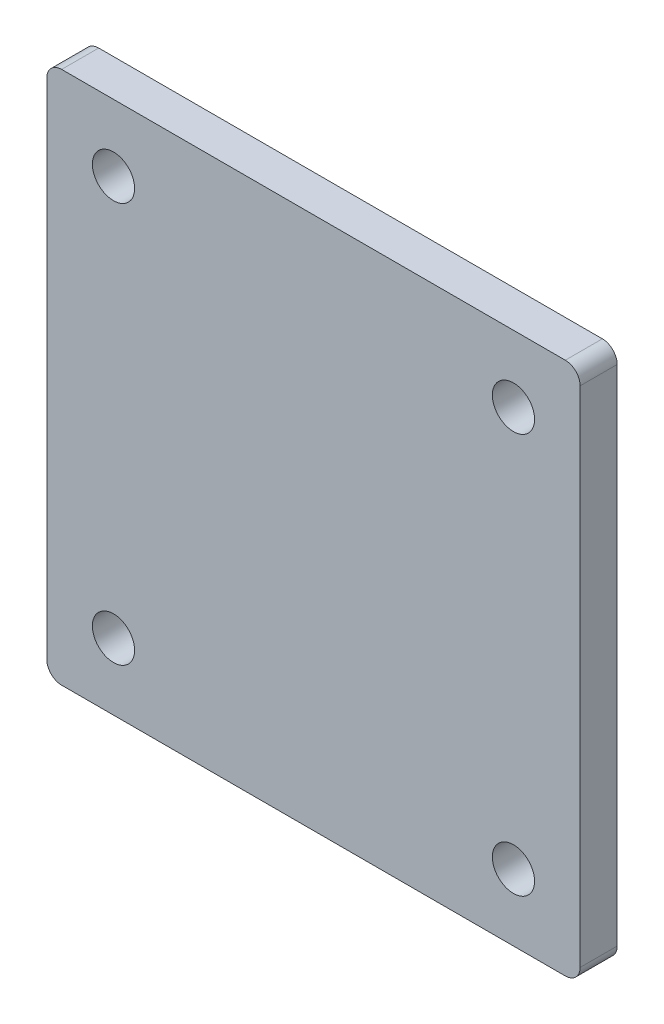
ISO-10303-21;
HEADER;
FILE_DESCRIPTION(('STEP AP214'),'2;1');
FILE_NAME('part.step','',(''),(''),'','','');
FILE_SCHEMA(('AUTOMOTIVE_DESIGN { 1 0 10303 214 1 1 1 1 }'));
ENDSEC;
DATA;
#1=APPLICATION_CONTEXT('core data for automotive mechanical design processes');
#2=APPLICATION_PROTOCOL_DEFINITION('international standard','automotive_design',2000,#1);
#3=PRODUCT_CONTEXT('',#1,'mechanical');
#4=PRODUCT('Part','Part','',(#3));
#5=PRODUCT_RELATED_PRODUCT_CATEGORY('part','',(#4));
#6=PRODUCT_DEFINITION_FORMATION('','',#4);
#7=PRODUCT_DEFINITION_CONTEXT('part definition',#1,'design');
#8=PRODUCT_DEFINITION('design','',#6,#7);
#9=PRODUCT_DEFINITION_SHAPE('','',#8);
#10=(LENGTH_UNIT() NAMED_UNIT(*) SI_UNIT(.MILLI.,.METRE.));
#11=(NAMED_UNIT(*) PLANE_ANGLE_UNIT() SI_UNIT($,.RADIAN.));
#12=(NAMED_UNIT(*) SI_UNIT($,.STERADIAN.) SOLID_ANGLE_UNIT());
#13=UNCERTAINTY_MEASURE_WITH_UNIT(LENGTH_MEASURE(1.E-05),#10,'distance_accuracy_value','');
#14=(GEOMETRIC_REPRESENTATION_CONTEXT(3) GLOBAL_UNCERTAINTY_ASSIGNED_CONTEXT((#13)) GLOBAL_UNIT_ASSIGNED_CONTEXT((#10,
#11,#12)) REPRESENTATION_CONTEXT('',''));
#15=CARTESIAN_POINT('',(0.,0.,0.));
#16=DIRECTION('',(0.,0.,1.));
#17=DIRECTION('',(1.,0.,0.));
#18=AXIS2_PLACEMENT_3D('',#15,#16,#17);
#19=CARTESIAN_POINT('',(0.,0.,5.));
#20=DIRECTION('',(0.,0.,1.));
#21=DIRECTION('',(1.,0.,0.));
#22=AXIS2_PLACEMENT_3D('',#19,#20,#21);
#23=PLANE('',#22);
#24=CARTESIAN_POINT('',(27.,-27.,5.));
#25=DIRECTION('',(0.,0.,1.));
#26=DIRECTION('',(1.,0.,0.));
#27=AXIS2_PLACEMENT_3D('',#24,#25,#26);
#28=CIRCLE('',#27,2.85);
#29=CARTESIAN_POINT('',(29.85,-27.,5.));
#30=VERTEX_POINT('',#29);
#31=EDGE_CURVE('E186',#30,#30,#28,.T.);
#32=ORIENTED_EDGE('',*,*,#31,.F.);
#33=EDGE_LOOP('',(#32));
#34=FACE_BOUND('',#33,.T.);
#35=CARTESIAN_POINT('',(-27.,27.,5.));
#36=DIRECTION('',(0.,0.,1.));
#37=DIRECTION('',(1.,0.,0.));
#38=AXIS2_PLACEMENT_3D('',#35,#36,#37);
#39=CIRCLE('',#38,2.85);
#40=CARTESIAN_POINT('',(-24.15,27.,5.));
#41=VERTEX_POINT('',#40);
#42=EDGE_CURVE('E130',#41,#41,#39,.T.);
#43=ORIENTED_EDGE('',*,*,#42,.F.);
#44=EDGE_LOOP('',(#43));
#45=FACE_BOUND('',#44,.T.);
#46=DIRECTION('',(0.,-1.,0.));
#47=VECTOR('',#46,1.);
#48=CARTESIAN_POINT('',(-36.,-36.,5.));
#49=LINE('',#48,#47);
#50=CARTESIAN_POINT('',(-36.,34.,5.));
#51=VERTEX_POINT('',#50);
#52=CARTESIAN_POINT('',(-36.,-34.,5.));
#53=VERTEX_POINT('',#52);
#54=EDGE_CURVE('E122',#51,#53,#49,.T.);
#55=ORIENTED_EDGE('',*,*,#54,.T.);
#56=CARTESIAN_POINT('',(-34.,-34.,5.));
#57=DIRECTION('',(0.,0.,1.));
#58=DIRECTION('',(1.,0.,0.));
#59=AXIS2_PLACEMENT_3D('',#56,#57,#58);
#60=CIRCLE('',#59,2.);
#61=CARTESIAN_POINT('',(-34.,-36.,5.));
#62=VERTEX_POINT('',#61);
#63=EDGE_CURVE('E162',#53,#62,#60,.T.);
#64=ORIENTED_EDGE('',*,*,#63,.T.);
#65=DIRECTION('',(1.,0.,0.));
#66=VECTOR('',#65,1.);
#67=CARTESIAN_POINT('',(36.,-36.,5.));
#68=LINE('',#67,#66);
#69=CARTESIAN_POINT('',(34.,-36.,5.));
#70=VERTEX_POINT('',#69);
#71=EDGE_CURVE('E176',#62,#70,#68,.T.);
#72=ORIENTED_EDGE('',*,*,#71,.T.);
#73=CARTESIAN_POINT('',(34.,-34.,5.));
#74=DIRECTION('',(0.,0.,1.));
#75=DIRECTION('',(1.,0.,0.));
#76=AXIS2_PLACEMENT_3D('',#73,#74,#75);
#77=CIRCLE('',#76,2.);
#78=CARTESIAN_POINT('',(36.,-34.,5.));
#79=VERTEX_POINT('',#78);
#80=EDGE_CURVE('E58',#70,#79,#77,.T.);
#81=ORIENTED_EDGE('',*,*,#80,.T.);
#82=DIRECTION('',(0.,1.,0.));
#83=VECTOR('',#82,1.);
#84=CARTESIAN_POINT('',(36.,-36.,5.));
#85=LINE('',#84,#83);
#86=CARTESIAN_POINT('',(36.,34.,5.));
#87=VERTEX_POINT('',#86);
#88=EDGE_CURVE('E168',#79,#87,#85,.T.);
#89=ORIENTED_EDGE('',*,*,#88,.T.);
#90=CARTESIAN_POINT('',(34.,34.,5.));
#91=DIRECTION('',(0.,0.,1.));
#92=DIRECTION('',(1.,0.,0.));
#93=AXIS2_PLACEMENT_3D('',#90,#91,#92);
#94=CIRCLE('',#93,2.);
#95=CARTESIAN_POINT('',(34.,36.,5.));
#96=VERTEX_POINT('',#95);
#97=EDGE_CURVE('E159',#87,#96,#94,.T.);
#98=ORIENTED_EDGE('',*,*,#97,.T.);
#99=DIRECTION('',(-1.,0.,0.));
#100=VECTOR('',#99,1.);
#101=CARTESIAN_POINT('',(36.,36.,5.));
#102=LINE('',#101,#100);
#103=CARTESIAN_POINT('',(-34.,36.,5.));
#104=VERTEX_POINT('',#103);
#105=EDGE_CURVE('E123',#96,#104,#102,.T.);
#106=ORIENTED_EDGE('',*,*,#105,.T.);
#107=CARTESIAN_POINT('',(-34.,34.,5.));
#108=DIRECTION('',(0.,0.,1.));
#109=DIRECTION('',(1.,0.,0.));
#110=AXIS2_PLACEMENT_3D('',#107,#108,#109);
#111=CIRCLE('',#110,2.);
#112=EDGE_CURVE('E145',#104,#51,#111,.T.);
#113=ORIENTED_EDGE('',*,*,#112,.T.);
#114=EDGE_LOOP('',(#55,#64,#72,#81,#89,#98,#106,#113));
#115=FACE_BOUND('',#114,.T.);
#116=CARTESIAN_POINT('',(27.,27.,5.));
#117=DIRECTION('',(0.,0.,1.));
#118=DIRECTION('',(1.,0.,0.));
#119=AXIS2_PLACEMENT_3D('',#116,#117,#118);
#120=CIRCLE('',#119,2.85);
#121=CARTESIAN_POINT('',(29.85,27.,5.));
#122=VERTEX_POINT('',#121);
#123=EDGE_CURVE('E181',#122,#122,#120,.T.);
#124=ORIENTED_EDGE('',*,*,#123,.F.);
#125=EDGE_LOOP('',(#124));
#126=FACE_BOUND('',#125,.T.);
#127=CARTESIAN_POINT('',(-27.,-27.,5.));
#128=DIRECTION('',(0.,0.,1.));
#129=DIRECTION('',(1.,0.,0.));
#130=AXIS2_PLACEMENT_3D('',#127,#128,#129);
#131=CIRCLE('',#130,2.85);
#132=CARTESIAN_POINT('',(-24.15,-27.,5.));
#133=VERTEX_POINT('',#132);
#134=EDGE_CURVE('E192',#133,#133,#131,.T.);
#135=ORIENTED_EDGE('',*,*,#134,.F.);
#136=EDGE_LOOP('',(#135));
#137=FACE_BOUND('',#136,.T.);
#138=ADVANCED_FACE('F36',(#34,#45,#115,#126,#137),#23,.T.);
#139=CARTESIAN_POINT('',(0.,0.,0.));
#140=DIRECTION('',(0.,0.,1.));
#141=DIRECTION('',(1.,0.,0.));
#142=AXIS2_PLACEMENT_3D('',#139,#140,#141);
#143=PLANE('',#142);
#144=DIRECTION('',(1.,0.,0.));
#145=VECTOR('',#144,1.);
#146=CARTESIAN_POINT('',(36.,-36.,0.));
#147=LINE('',#146,#145);
#148=CARTESIAN_POINT('',(-34.,-36.,0.));
#149=VERTEX_POINT('',#148);
#150=CARTESIAN_POINT('',(34.,-36.,0.));
#151=VERTEX_POINT('',#150);
#152=EDGE_CURVE('E129',#149,#151,#147,.T.);
#153=ORIENTED_EDGE('',*,*,#152,.F.);
#154=CARTESIAN_POINT('',(-34.,-34.,0.));
#155=DIRECTION('',(0.,0.,1.));
#156=DIRECTION('',(1.,0.,0.));
#157=AXIS2_PLACEMENT_3D('',#154,#155,#156);
#158=CIRCLE('',#157,2.);
#159=CARTESIAN_POINT('',(-36.,-34.,0.));
#160=VERTEX_POINT('',#159);
#161=EDGE_CURVE('E128',#149,#160,#158,.F.);
#162=ORIENTED_EDGE('',*,*,#161,.T.);
#163=DIRECTION('',(0.,-1.,0.));
#164=VECTOR('',#163,1.);
#165=CARTESIAN_POINT('',(-36.,-36.,0.));
#166=LINE('',#165,#164);
#167=CARTESIAN_POINT('',(-36.,34.,0.));
#168=VERTEX_POINT('',#167);
#169=EDGE_CURVE('E119',#168,#160,#166,.T.);
#170=ORIENTED_EDGE('',*,*,#169,.F.);
#171=CARTESIAN_POINT('',(-34.,34.,0.));
#172=DIRECTION('',(0.,0.,1.));
#173=DIRECTION('',(1.,0.,0.));
#174=AXIS2_PLACEMENT_3D('',#171,#172,#173);
#175=CIRCLE('',#174,2.);
#176=CARTESIAN_POINT('',(-34.,36.,0.));
#177=VERTEX_POINT('',#176);
#178=EDGE_CURVE('E104',#168,#177,#175,.F.);
#179=ORIENTED_EDGE('',*,*,#178,.T.);
#180=DIRECTION('',(-1.,0.,0.));
#181=VECTOR('',#180,1.);
#182=CARTESIAN_POINT('',(36.,36.,0.));
#183=LINE('',#182,#181);
#184=CARTESIAN_POINT('',(34.,36.,0.));
#185=VERTEX_POINT('',#184);
#186=EDGE_CURVE('E142',#185,#177,#183,.T.);
#187=ORIENTED_EDGE('',*,*,#186,.F.);
#188=CARTESIAN_POINT('',(34.,34.,0.));
#189=DIRECTION('',(0.,0.,1.));
#190=DIRECTION('',(1.,0.,0.));
#191=AXIS2_PLACEMENT_3D('',#188,#189,#190);
#192=CIRCLE('',#191,2.);
#193=CARTESIAN_POINT('',(36.,34.,0.));
#194=VERTEX_POINT('',#193);
#195=EDGE_CURVE('E152',#185,#194,#192,.F.);
#196=ORIENTED_EDGE('',*,*,#195,.T.);
#197=DIRECTION('',(0.,1.,0.));
#198=VECTOR('',#197,1.);
#199=CARTESIAN_POINT('',(36.,-36.,0.));
#200=LINE('',#199,#198);
#201=CARTESIAN_POINT('',(36.,-34.,0.));
#202=VERTEX_POINT('',#201);
#203=EDGE_CURVE('E133',#202,#194,#200,.T.);
#204=ORIENTED_EDGE('',*,*,#203,.F.);
#205=CARTESIAN_POINT('',(34.,-34.,0.));
#206=DIRECTION('',(0.,0.,1.));
#207=DIRECTION('',(1.,0.,0.));
#208=AXIS2_PLACEMENT_3D('',#205,#206,#207);
#209=CIRCLE('',#208,2.);
#210=EDGE_CURVE('E154',#202,#151,#209,.F.);
#211=ORIENTED_EDGE('',*,*,#210,.T.);
#212=EDGE_LOOP('',(#153,#162,#170,#179,#187,#196,#204,#211));
#213=FACE_BOUND('',#212,.T.);
#214=CARTESIAN_POINT('',(-27.,27.,0.));
#215=DIRECTION('',(0.,0.,1.));
#216=DIRECTION('',(1.,0.,0.));
#217=AXIS2_PLACEMENT_3D('',#214,#215,#216);
#218=CIRCLE('',#217,2.85);
#219=CARTESIAN_POINT('',(-24.15,27.,0.));
#220=VERTEX_POINT('',#219);
#221=EDGE_CURVE('E136',#220,#220,#218,.T.);
#222=ORIENTED_EDGE('',*,*,#221,.T.);
#223=EDGE_LOOP('',(#222));
#224=FACE_BOUND('',#223,.T.);
#225=CARTESIAN_POINT('',(27.,27.,0.));
#226=DIRECTION('',(0.,0.,1.));
#227=DIRECTION('',(1.,0.,0.));
#228=AXIS2_PLACEMENT_3D('',#225,#226,#227);
#229=CIRCLE('',#228,2.85);
#230=CARTESIAN_POINT('',(29.85,27.,0.));
#231=VERTEX_POINT('',#230);
#232=EDGE_CURVE('E183',#231,#231,#229,.T.);
#233=ORIENTED_EDGE('',*,*,#232,.T.);
#234=EDGE_LOOP('',(#233));
#235=FACE_BOUND('',#234,.T.);
#236=CARTESIAN_POINT('',(27.,-27.,0.));
#237=DIRECTION('',(0.,0.,1.));
#238=DIRECTION('',(1.,0.,0.));
#239=AXIS2_PLACEMENT_3D('',#236,#237,#238);
#240=CIRCLE('',#239,2.85);
#241=CARTESIAN_POINT('',(29.85,-27.,0.));
#242=VERTEX_POINT('',#241);
#243=EDGE_CURVE('E189',#242,#242,#240,.T.);
#244=ORIENTED_EDGE('',*,*,#243,.T.);
#245=EDGE_LOOP('',(#244));
#246=FACE_BOUND('',#245,.T.);
#247=CARTESIAN_POINT('',(-27.,-27.,0.));
#248=DIRECTION('',(0.,0.,1.));
#249=DIRECTION('',(1.,0.,0.));
#250=AXIS2_PLACEMENT_3D('',#247,#248,#249);
#251=CIRCLE('',#250,2.85);
#252=CARTESIAN_POINT('',(-24.15,-27.,0.));
#253=VERTEX_POINT('',#252);
#254=EDGE_CURVE('E195',#253,#253,#251,.T.);
#255=ORIENTED_EDGE('',*,*,#254,.T.);
#256=EDGE_LOOP('',(#255));
#257=FACE_BOUND('',#256,.T.);
#258=ADVANCED_FACE('F126',(#213,#224,#235,#246,#257),#143,.F.);
#259=CARTESIAN_POINT('',(-36.,-36.,5.));
#260=DIRECTION('',(1.,0.,0.));
#261=DIRECTION('',(0.,0.,-1.));
#262=AXIS2_PLACEMENT_3D('',#259,#260,#261);
#263=PLANE('',#262);
#264=ORIENTED_EDGE('',*,*,#169,.T.);
#265=DIRECTION('',(0.,0.,-1.));
#266=VECTOR('',#265,1.);
#267=CARTESIAN_POINT('',(-36.,-34.,5.));
#268=LINE('',#267,#266);
#269=EDGE_CURVE('E157',#160,#53,#268,.F.);
#270=ORIENTED_EDGE('',*,*,#269,.T.);
#271=ORIENTED_EDGE('',*,*,#54,.F.);
#272=DIRECTION('',(0.,0.,-1.));
#273=VECTOR('',#272,1.);
#274=CARTESIAN_POINT('',(-36.,34.,5.));
#275=LINE('',#274,#273);
#276=EDGE_CURVE('E108',#51,#168,#275,.T.);
#277=ORIENTED_EDGE('',*,*,#276,.T.);
#278=EDGE_LOOP('',(#264,#270,#271,#277));
#279=FACE_BOUND('',#278,.T.);
#280=ADVANCED_FACE('F118',(#279),#263,.F.);
#281=CARTESIAN_POINT('',(36.,-36.,5.));
#282=DIRECTION('',(0.,1.,0.));
#283=DIRECTION('',(-1.,0.,0.));
#284=AXIS2_PLACEMENT_3D('',#281,#282,#283);
#285=PLANE('',#284);
#286=ORIENTED_EDGE('',*,*,#71,.F.);
#287=DIRECTION('',(0.,0.,-1.));
#288=VECTOR('',#287,1.);
#289=CARTESIAN_POINT('',(-34.,-36.,5.));
#290=LINE('',#289,#288);
#291=EDGE_CURVE('E149',#62,#149,#290,.T.);
#292=ORIENTED_EDGE('',*,*,#291,.T.);
#293=ORIENTED_EDGE('',*,*,#152,.T.);
#294=DIRECTION('',(0.,0.,-1.));
#295=VECTOR('',#294,1.);
#296=CARTESIAN_POINT('',(34.,-36.,5.));
#297=LINE('',#296,#295);
#298=EDGE_CURVE('E147',#151,#70,#297,.F.);
#299=ORIENTED_EDGE('',*,*,#298,.T.);
#300=EDGE_LOOP('',(#286,#292,#293,#299));
#301=FACE_BOUND('',#300,.T.);
#302=ADVANCED_FACE('F221',(#301),#285,.F.);
#303=CARTESIAN_POINT('',(36.,-36.,5.));
#304=DIRECTION('',(-1.,0.,0.));
#305=DIRECTION('',(0.,0.,1.));
#306=AXIS2_PLACEMENT_3D('',#303,#304,#305);
#307=PLANE('',#306);
#308=ORIENTED_EDGE('',*,*,#88,.F.);
#309=DIRECTION('',(0.,0.,-1.));
#310=VECTOR('',#309,1.);
#311=CARTESIAN_POINT('',(36.,-34.,5.));
#312=LINE('',#311,#310);
#313=EDGE_CURVE('E44',#79,#202,#312,.T.);
#314=ORIENTED_EDGE('',*,*,#313,.T.);
#315=ORIENTED_EDGE('',*,*,#203,.T.);
#316=DIRECTION('',(0.,0.,-1.));
#317=VECTOR('',#316,1.);
#318=CARTESIAN_POINT('',(36.,34.,5.));
#319=LINE('',#318,#317);
#320=EDGE_CURVE('E51',#194,#87,#319,.F.);
#321=ORIENTED_EDGE('',*,*,#320,.T.);
#322=EDGE_LOOP('',(#308,#314,#315,#321));
#323=FACE_BOUND('',#322,.T.);
#324=ADVANCED_FACE('F167',(#323),#307,.F.);
#325=CARTESIAN_POINT('',(36.,36.,5.));
#326=DIRECTION('',(0.,-1.,0.));
#327=DIRECTION('',(1.,0.,0.));
#328=AXIS2_PLACEMENT_3D('',#325,#326,#327);
#329=PLANE('',#328);
#330=ORIENTED_EDGE('',*,*,#105,.F.);
#331=DIRECTION('',(0.,0.,-1.));
#332=VECTOR('',#331,1.);
#333=CARTESIAN_POINT('',(34.,36.,5.));
#334=LINE('',#333,#332);
#335=EDGE_CURVE('E11',#96,#185,#334,.T.);
#336=ORIENTED_EDGE('',*,*,#335,.T.);
#337=ORIENTED_EDGE('',*,*,#186,.T.);
#338=DIRECTION('',(0.,0.,-1.));
#339=VECTOR('',#338,1.);
#340=CARTESIAN_POINT('',(-34.,36.,5.));
#341=LINE('',#340,#339);
#342=EDGE_CURVE('E110',#177,#104,#341,.F.);
#343=ORIENTED_EDGE('',*,*,#342,.T.);
#344=EDGE_LOOP('',(#330,#336,#337,#343));
#345=FACE_BOUND('',#344,.T.);
#346=ADVANCED_FACE('F175',(#345),#329,.F.);
#347=CARTESIAN_POINT('',(-27.,27.,5.));
#348=DIRECTION('',(0.,0.,-1.));
#349=DIRECTION('',(-1.,0.,0.));
#350=AXIS2_PLACEMENT_3D('',#347,#348,#349);
#351=CYLINDRICAL_SURFACE('',#350,2.85);
#352=ORIENTED_EDGE('',*,*,#42,.T.);
#353=EDGE_LOOP('',(#352));
#354=FACE_BOUND('',#353,.T.);
#355=ORIENTED_EDGE('',*,*,#221,.F.);
#356=EDGE_LOOP('',(#355));
#357=FACE_BOUND('',#356,.T.);
#358=ADVANCED_FACE('F214',(#354,#357),#351,.F.);
#359=CARTESIAN_POINT('',(27.,27.,5.));
#360=DIRECTION('',(0.,0.,-1.));
#361=DIRECTION('',(-1.,0.,0.));
#362=AXIS2_PLACEMENT_3D('',#359,#360,#361);
#363=CYLINDRICAL_SURFACE('',#362,2.85);
#364=ORIENTED_EDGE('',*,*,#123,.T.);
#365=EDGE_LOOP('',(#364));
#366=FACE_BOUND('',#365,.T.);
#367=ORIENTED_EDGE('',*,*,#232,.F.);
#368=EDGE_LOOP('',(#367));
#369=FACE_BOUND('',#368,.T.);
#370=ADVANCED_FACE('F244',(#366,#369),#363,.F.);
#371=CARTESIAN_POINT('',(27.,-27.,5.));
#372=DIRECTION('',(0.,0.,-1.));
#373=DIRECTION('',(-1.,0.,0.));
#374=AXIS2_PLACEMENT_3D('',#371,#372,#373);
#375=CYLINDRICAL_SURFACE('',#374,2.85);
#376=ORIENTED_EDGE('',*,*,#31,.T.);
#377=EDGE_LOOP('',(#376));
#378=FACE_BOUND('',#377,.T.);
#379=ORIENTED_EDGE('',*,*,#243,.F.);
#380=EDGE_LOOP('',(#379));
#381=FACE_BOUND('',#380,.T.);
#382=ADVANCED_FACE('F247',(#378,#381),#375,.F.);
#383=CARTESIAN_POINT('',(-27.,-27.,5.));
#384=DIRECTION('',(0.,0.,-1.));
#385=DIRECTION('',(-1.,0.,0.));
#386=AXIS2_PLACEMENT_3D('',#383,#384,#385);
#387=CYLINDRICAL_SURFACE('',#386,2.85);
#388=ORIENTED_EDGE('',*,*,#134,.T.);
#389=EDGE_LOOP('',(#388));
#390=FACE_BOUND('',#389,.T.);
#391=ORIENTED_EDGE('',*,*,#254,.F.);
#392=EDGE_LOOP('',(#391));
#393=FACE_BOUND('',#392,.T.);
#394=ADVANCED_FACE('F201',(#390,#393),#387,.F.);
#395=CARTESIAN_POINT('',(-34.,34.,5.));
#396=DIRECTION('',(0.,0.,-1.));
#397=DIRECTION('',(-1.,0.,0.));
#398=AXIS2_PLACEMENT_3D('',#395,#396,#397);
#399=CYLINDRICAL_SURFACE('',#398,2.);
#400=ORIENTED_EDGE('',*,*,#112,.F.);
#401=ORIENTED_EDGE('',*,*,#342,.F.);
#402=ORIENTED_EDGE('',*,*,#178,.F.);
#403=ORIENTED_EDGE('',*,*,#276,.F.);
#404=EDGE_LOOP('',(#400,#401,#402,#403));
#405=FACE_BOUND('',#404,.T.);
#406=ADVANCED_FACE('F107',(#405),#399,.T.);
#407=CARTESIAN_POINT('',(-34.,-34.,5.));
#408=DIRECTION('',(0.,0.,-1.));
#409=DIRECTION('',(-1.,0.,0.));
#410=AXIS2_PLACEMENT_3D('',#407,#408,#409);
#411=CYLINDRICAL_SURFACE('',#410,2.);
#412=ORIENTED_EDGE('',*,*,#63,.F.);
#413=ORIENTED_EDGE('',*,*,#269,.F.);
#414=ORIENTED_EDGE('',*,*,#161,.F.);
#415=ORIENTED_EDGE('',*,*,#291,.F.);
#416=EDGE_LOOP('',(#412,#413,#414,#415));
#417=FACE_BOUND('',#416,.T.);
#418=ADVANCED_FACE('F229',(#417),#411,.T.);
#419=CARTESIAN_POINT('',(34.,-34.,5.));
#420=DIRECTION('',(0.,0.,-1.));
#421=DIRECTION('',(-1.,0.,0.));
#422=AXIS2_PLACEMENT_3D('',#419,#420,#421);
#423=CYLINDRICAL_SURFACE('',#422,2.);
#424=ORIENTED_EDGE('',*,*,#80,.F.);
#425=ORIENTED_EDGE('',*,*,#298,.F.);
#426=ORIENTED_EDGE('',*,*,#210,.F.);
#427=ORIENTED_EDGE('',*,*,#313,.F.);
#428=EDGE_LOOP('',(#424,#425,#426,#427));
#429=FACE_BOUND('',#428,.T.);
#430=ADVANCED_FACE('F231',(#429),#423,.T.);
#431=CARTESIAN_POINT('',(34.,34.,5.));
#432=DIRECTION('',(0.,0.,-1.));
#433=DIRECTION('',(-1.,0.,0.));
#434=AXIS2_PLACEMENT_3D('',#431,#432,#433);
#435=CYLINDRICAL_SURFACE('',#434,2.);
#436=ORIENTED_EDGE('',*,*,#97,.F.);
#437=ORIENTED_EDGE('',*,*,#320,.F.);
#438=ORIENTED_EDGE('',*,*,#195,.F.);
#439=ORIENTED_EDGE('',*,*,#335,.F.);
#440=EDGE_LOOP('',(#436,#437,#438,#439));
#441=FACE_BOUND('',#440,.T.);
#442=ADVANCED_FACE('F38',(#441),#435,.T.);
#443=CLOSED_SHELL('',(#138,#258,#280,#302,#324,#346,#358,#370,#382,#394,#406,#418,#430,#442));
#444=MANIFOLD_SOLID_BREP('B2',#443);
#445=ADVANCED_BREP_SHAPE_REPRESENTATION('',(#18,#444),#14);
#446=SHAPE_DEFINITION_REPRESENTATION(#9,#445);
ENDSEC;
END-ISO-10303-21;
